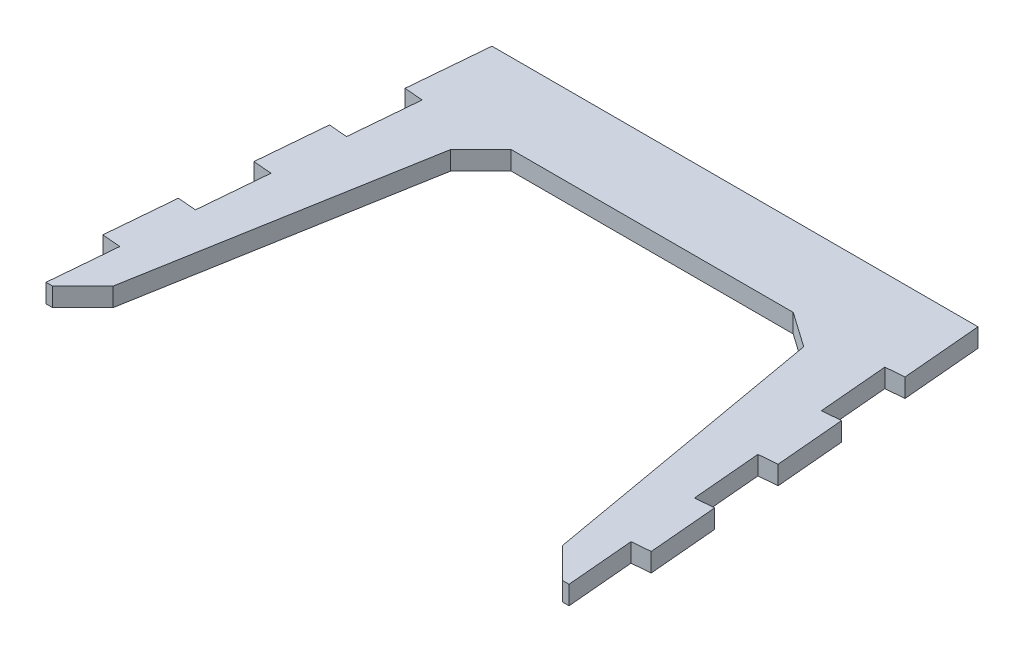
ISO-10303-21;
HEADER;
FILE_DESCRIPTION(('STEP AP214'),'2;1');
FILE_NAME('part.step','',(''),(''),'','','');
FILE_SCHEMA(('AUTOMOTIVE_DESIGN { 1 0 10303 214 1 1 1 1 }'));
ENDSEC;
DATA;
#1=APPLICATION_CONTEXT('core data for automotive mechanical design processes');
#2=APPLICATION_PROTOCOL_DEFINITION('international standard','automotive_design',2000,#1);
#3=PRODUCT_CONTEXT('',#1,'mechanical');
#4=PRODUCT('Part','Part','',(#3));
#5=PRODUCT_RELATED_PRODUCT_CATEGORY('part','',(#4));
#6=PRODUCT_DEFINITION_FORMATION('','',#4);
#7=PRODUCT_DEFINITION_CONTEXT('part definition',#1,'design');
#8=PRODUCT_DEFINITION('design','',#6,#7);
#9=PRODUCT_DEFINITION_SHAPE('','',#8);
#10=(LENGTH_UNIT() NAMED_UNIT(*) SI_UNIT(.MILLI.,.METRE.));
#11=(NAMED_UNIT(*) PLANE_ANGLE_UNIT() SI_UNIT($,.RADIAN.));
#12=(NAMED_UNIT(*) SI_UNIT($,.STERADIAN.) SOLID_ANGLE_UNIT());
#13=UNCERTAINTY_MEASURE_WITH_UNIT(LENGTH_MEASURE(1.E-05),#10,'distance_accuracy_value','');
#14=(GEOMETRIC_REPRESENTATION_CONTEXT(3) GLOBAL_UNCERTAINTY_ASSIGNED_CONTEXT((#13)) GLOBAL_UNIT_ASSIGNED_CONTEXT((#10,
#11,#12)) REPRESENTATION_CONTEXT('',''));
#15=CARTESIAN_POINT('',(0.,0.,0.));
#16=DIRECTION('',(0.,0.,1.));
#17=DIRECTION('',(1.,0.,0.));
#18=AXIS2_PLACEMENT_3D('',#15,#16,#17);
#19=CARTESIAN_POINT('',(-195.0905685814,-15.,-343.177241045668));
#20=DIRECTION('',(-0.99622365842126,0.,-0.0868240888334583));
#21=DIRECTION('',(-0.0868240888334583,0.,0.99622365842126));
#22=AXIS2_PLACEMENT_3D('',#19,#20,#21);
#23=PLANE('',#22);
#24=DIRECTION('',(-0.0868240888334583,0.,0.99622365842126));
#25=VECTOR('',#24,1.);
#26=CARTESIAN_POINT('',(-195.0905685814,-15.,-343.177241045668));
#27=LINE('',#26,#25);
#28=CARTESIAN_POINT('',(-205.544758775303,-15.,-223.225373531356));
#29=VERTEX_POINT('',#28);
#30=CARTESIAN_POINT('',(-210.408460690414,-15.,-167.419030148517));
#31=VERTEX_POINT('',#30);
#32=EDGE_CURVE('E266',#29,#31,#27,.T.);
#33=ORIENTED_EDGE('',*,*,#32,.T.);
#34=DIRECTION('',(0.,1.,0.));
#35=VECTOR('',#34,1.);
#36=CARTESIAN_POINT('',(-210.408460690414,-15.,-167.419030148517));
#37=LINE('',#36,#35);
#38=CARTESIAN_POINT('',(-210.408460690414,0.,-167.419030148517));
#39=VERTEX_POINT('',#38);
#40=EDGE_CURVE('E396',#31,#39,#37,.T.);
#41=ORIENTED_EDGE('',*,*,#40,.T.);
#42=DIRECTION('',(-0.0868240888334583,0.,0.99622365842126));
#43=VECTOR('',#42,1.);
#44=CARTESIAN_POINT('',(-195.0905685814,0.,-343.177241045668));
#45=LINE('',#44,#43);
#46=CARTESIAN_POINT('',(-205.544758775303,0.,-223.225373531356));
#47=VERTEX_POINT('',#46);
#48=EDGE_CURVE('E349',#47,#39,#45,.T.);
#49=ORIENTED_EDGE('',*,*,#48,.F.);
#50=DIRECTION('',(0.,1.,0.));
#51=VECTOR('',#50,1.);
#52=CARTESIAN_POINT('',(-205.544758775303,-15.,-223.225373531356));
#53=LINE('',#52,#51);
#54=EDGE_CURVE('E56',#29,#47,#53,.T.);
#55=ORIENTED_EDGE('',*,*,#54,.F.);
#56=EDGE_LOOP('',(#33,#41,#49,#55));
#57=FACE_BOUND('',#56,.T.);
#58=ADVANCED_FACE('F33',(#57),#23,.T.);
#59=CARTESIAN_POINT('',(-215.272162605525,0.,-111.612686765678));
#60=VERTEX_POINT('',#59);
#61=CARTESIAN_POINT('',(-220.135864520635,0.,-55.806343382839));
#62=VERTEX_POINT('',#61);
#63=EDGE_CURVE('E258',#60,#62,#45,.T.);
#64=ORIENTED_EDGE('',*,*,#63,.F.);
#65=DIRECTION('',(0.,1.,0.));
#66=VECTOR('',#65,1.);
#67=CARTESIAN_POINT('',(-215.272162605525,-15.,-111.612686765678));
#68=LINE('',#67,#66);
#69=CARTESIAN_POINT('',(-215.272162605525,-15.,-111.612686765678));
#70=VERTEX_POINT('',#69);
#71=EDGE_CURVE('E48',#70,#60,#68,.T.);
#72=ORIENTED_EDGE('',*,*,#71,.F.);
#73=CARTESIAN_POINT('',(-220.135864520635,-15.,-55.806343382839));
#74=VERTEX_POINT('',#73);
#75=EDGE_CURVE('E256',#70,#74,#27,.T.);
#76=ORIENTED_EDGE('',*,*,#75,.T.);
#77=DIRECTION('',(0.,1.,0.));
#78=VECTOR('',#77,1.);
#79=CARTESIAN_POINT('',(-220.135864520635,-15.,-55.806343382839));
#80=LINE('',#79,#78);
#81=EDGE_CURVE('E416',#74,#62,#80,.T.);
#82=ORIENTED_EDGE('',*,*,#81,.T.);
#83=EDGE_LOOP('',(#64,#72,#76,#82));
#84=FACE_BOUND('',#83,.T.);
#85=ADVANCED_FACE('F254',(#84),#23,.T.);
#86=CARTESIAN_POINT('',(0.,-15.,0.));
#87=DIRECTION('',(0.,1.,0.));
#88=DIRECTION('',(0.,0.,1.));
#89=AXIS2_PLACEMENT_3D('',#86,#87,#88);
#90=PLANE('',#89);
#91=DIRECTION('',(0.99622365842126,0.,0.0868240888334588));
#92=VECTOR('',#91,1.);
#93=CARTESIAN_POINT('',(-210.408460690414,-15.,-167.419030148517));
#94=LINE('',#93,#92);
#95=CARTESIAN_POINT('',(-195.464671396523,-15.,-166.11663095513));
#96=VERTEX_POINT('',#95);
#97=EDGE_CURVE('E259',#31,#96,#94,.T.);
#98=ORIENTED_EDGE('',*,*,#97,.F.);
#99=ORIENTED_EDGE('',*,*,#32,.F.);
#100=DIRECTION('',(-0.99622365842126,0.,-0.0868240888334586));
#101=VECTOR('',#100,1.);
#102=CARTESIAN_POINT('',(-190.600969481413,-15.,-221.922974337969));
#103=LINE('',#102,#101);
#104=CARTESIAN_POINT('',(-190.600969481413,-15.,-221.922974337969));
#105=VERTEX_POINT('',#104);
#106=EDGE_CURVE('E389',#105,#29,#103,.T.);
#107=ORIENTED_EDGE('',*,*,#106,.F.);
#108=DIRECTION('',(-0.0868240888334584,0.,0.99622365842126));
#109=VECTOR('',#108,1.);
#110=CARTESIAN_POINT('',(-185.737267566302,-15.,-277.729317720808));
#111=LINE('',#110,#109);
#112=CARTESIAN_POINT('',(-185.737267566302,-15.,-277.729317720808));
#113=VERTEX_POINT('',#112);
#114=EDGE_CURVE('E383',#113,#105,#111,.T.);
#115=ORIENTED_EDGE('',*,*,#114,.F.);
#116=DIRECTION('',(0.99622365842126,0.,0.0868240888334571));
#117=VECTOR('',#116,1.);
#118=CARTESIAN_POINT('',(-200.681056860192,-15.,-279.031716914195));
#119=LINE('',#118,#117);
#120=CARTESIAN_POINT('',(-200.681056860192,-15.,-279.031716914195));
#121=VERTEX_POINT('',#120);
#122=EDGE_CURVE('E381',#121,#113,#119,.T.);
#123=ORIENTED_EDGE('',*,*,#122,.F.);
#124=CARTESIAN_POINT('',(-195.0905685814,-15.,-343.177241045668));
#125=VERTEX_POINT('',#124);
#126=EDGE_CURVE('E269',#125,#121,#27,.T.);
#127=ORIENTED_EDGE('',*,*,#126,.F.);
#128=DIRECTION('',(-1.,0.,0.));
#129=VECTOR('',#128,1.);
#130=CARTESIAN_POINT('',(195.0905685814,-15.,-343.177241045668));
#131=LINE('',#130,#129);
#132=CARTESIAN_POINT('',(195.0905685814,-15.,-343.177241045668));
#133=VERTEX_POINT('',#132);
#134=EDGE_CURVE('E267',#133,#125,#131,.T.);
#135=ORIENTED_EDGE('',*,*,#134,.F.);
#136=DIRECTION('',(-0.0868240888334583,0.,-0.99622365842126));
#137=VECTOR('',#136,1.);
#138=CARTESIAN_POINT('',(224.999566435746,-15.,0.));
#139=LINE('',#138,#137);
#140=CARTESIAN_POINT('',(200.681056860192,-15.,-279.031716914195));
#141=VERTEX_POINT('',#140);
#142=EDGE_CURVE('E362',#141,#133,#139,.T.);
#143=ORIENTED_EDGE('',*,*,#142,.F.);
#144=DIRECTION('',(-0.99622365842126,0.,0.0868240888334571));
#145=VECTOR('',#144,1.);
#146=CARTESIAN_POINT('',(200.681056860192,-15.,-279.031716914195));
#147=LINE('',#146,#145);
#148=CARTESIAN_POINT('',(185.737267566302,-15.,-277.729317720808));
#149=VERTEX_POINT('',#148);
#150=EDGE_CURVE('E447',#141,#149,#147,.T.);
#151=ORIENTED_EDGE('',*,*,#150,.T.);
#152=DIRECTION('',(0.0868240888334584,0.,0.99622365842126));
#153=VECTOR('',#152,1.);
#154=CARTESIAN_POINT('',(185.737267566302,-15.,-277.729317720808));
#155=LINE('',#154,#153);
#156=CARTESIAN_POINT('',(190.600969481413,-15.,-221.922974337969));
#157=VERTEX_POINT('',#156);
#158=EDGE_CURVE('E449',#149,#157,#155,.T.);
#159=ORIENTED_EDGE('',*,*,#158,.T.);
#160=DIRECTION('',(0.99622365842126,0.,-0.0868240888334586));
#161=VECTOR('',#160,1.);
#162=CARTESIAN_POINT('',(190.600969481413,-15.,-221.922974337969));
#163=LINE('',#162,#161);
#164=CARTESIAN_POINT('',(205.544758775303,-15.,-223.225373531356));
#165=VERTEX_POINT('',#164);
#166=EDGE_CURVE('E453',#157,#165,#163,.T.);
#167=ORIENTED_EDGE('',*,*,#166,.T.);
#168=CARTESIAN_POINT('',(210.408460690414,-15.,-167.419030148517));
#169=VERTEX_POINT('',#168);
#170=EDGE_CURVE('E364',#169,#165,#139,.T.);
#171=ORIENTED_EDGE('',*,*,#170,.F.);
#172=DIRECTION('',(-0.99622365842126,0.,0.0868240888334588));
#173=VECTOR('',#172,1.);
#174=CARTESIAN_POINT('',(210.408460690414,-15.,-167.419030148517));
#175=LINE('',#174,#173);
#176=CARTESIAN_POINT('',(195.464671396523,-15.,-166.11663095513));
#177=VERTEX_POINT('',#176);
#178=EDGE_CURVE('E422',#169,#177,#175,.T.);
#179=ORIENTED_EDGE('',*,*,#178,.T.);
#180=DIRECTION('',(0.086824088833458,0.,0.99622365842126));
#181=VECTOR('',#180,1.);
#182=CARTESIAN_POINT('',(195.464671396523,-15.,-166.11663095513));
#183=LINE('',#182,#181);
#184=CARTESIAN_POINT('',(200.328373311634,-15.,-110.310287572291));
#185=VERTEX_POINT('',#184);
#186=EDGE_CURVE('E425',#177,#185,#183,.T.);
#187=ORIENTED_EDGE('',*,*,#186,.T.);
#188=DIRECTION('',(0.99622365842126,0.,-0.0868240888334583));
#189=VECTOR('',#188,1.);
#190=CARTESIAN_POINT('',(200.328373311634,-15.,-110.310287572291));
#191=LINE('',#190,#189);
#192=CARTESIAN_POINT('',(215.272162605525,-15.,-111.612686765678));
#193=VERTEX_POINT('',#192);
#194=EDGE_CURVE('E429',#185,#193,#191,.T.);
#195=ORIENTED_EDGE('',*,*,#194,.T.);
#196=CARTESIAN_POINT('',(220.135864520635,-15.,-55.806343382839));
#197=VERTEX_POINT('',#196);
#198=EDGE_CURVE('E272',#197,#193,#139,.T.);
#199=ORIENTED_EDGE('',*,*,#198,.F.);
#200=DIRECTION('',(-0.99622365842126,0.,0.0868240888334585));
#201=VECTOR('',#200,1.);
#202=CARTESIAN_POINT('',(220.135864520635,-15.,-55.806343382839));
#203=LINE('',#202,#201);
#204=CARTESIAN_POINT('',(205.192075226745,-15.,-54.5039441894517));
#205=VERTEX_POINT('',#204);
#206=EDGE_CURVE('E472',#197,#205,#203,.T.);
#207=ORIENTED_EDGE('',*,*,#206,.T.);
#208=DIRECTION('',(0.0868240888334577,0.,0.99622365842126));
#209=VECTOR('',#208,1.);
#210=CARTESIAN_POINT('',(205.192075226745,-15.,-54.5039441894517));
#211=LINE('',#210,#209);
#212=CARTESIAN_POINT('',(209.942268872596,-15.,0.));
#213=VERTEX_POINT('',#212);
#214=EDGE_CURVE('E475',#205,#213,#211,.T.);
#215=ORIENTED_EDGE('',*,*,#214,.T.);
#216=DIRECTION('',(1.,0.,0.));
#217=VECTOR('',#216,1.);
#218=CARTESIAN_POINT('',(184.65484784243,-15.,0.));
#219=LINE('',#218,#217);
#220=CARTESIAN_POINT('',(204.65484784243,-15.,0.));
#221=VERTEX_POINT('',#220);
#222=EDGE_CURVE('E359',#221,#213,#219,.T.);
#223=ORIENTED_EDGE('',*,*,#222,.F.);
#224=DIRECTION('',(0.707106781186549,0.,0.707106781186546));
#225=VECTOR('',#224,1.);
#226=CARTESIAN_POINT('',(180.383482301595,-15.,-24.2713655408353));
#227=LINE('',#226,#225);
#228=CARTESIAN_POINT('',(180.383482301595,-15.,-24.2713655408353));
#229=VERTEX_POINT('',#228);
#230=EDGE_CURVE('E316',#221,#229,#227,.F.);
#231=ORIENTED_EDGE('',*,*,#230,.T.);
#232=DIRECTION('',(0.173320309855024,0.,0.984865508682154));
#233=VECTOR('',#232,1.);
#234=CARTESIAN_POINT('',(135.549804353131,-15.,-279.031716914195));
#235=LINE('',#234,#233);
#236=CARTESIAN_POINT('',(139.016210550232,-15.,-259.334406740552));
#237=VERTEX_POINT('',#236);
#238=EDGE_CURVE('E356',#237,#229,#235,.T.);
#239=ORIENTED_EDGE('',*,*,#238,.F.);
#240=DIRECTION('',(0.818961046161734,0.,0.573849113330045));
#241=VECTOR('',#240,1.);
#242=CARTESIAN_POINT('',(167.655244051473,-15.,-239.266927269653));
#243=LINE('',#242,#241);
#244=CARTESIAN_POINT('',(110.905459184304,-15.,-279.031716914195));
#245=VERTEX_POINT('',#244);
#246=EDGE_CURVE('E307',#237,#245,#243,.F.);
#247=ORIENTED_EDGE('',*,*,#246,.T.);
#248=DIRECTION('',(1.,0.,0.));
#249=VECTOR('',#248,1.);
#250=CARTESIAN_POINT('',(-135.549804353131,-15.,-279.031716914195));
#251=LINE('',#250,#249);
#252=CARTESIAN_POINT('',(-115.549804353131,-15.,-279.031716914195));
#253=VERTEX_POINT('',#252);
#254=EDGE_CURVE('E337',#253,#245,#251,.T.);
#255=ORIENTED_EDGE('',*,*,#254,.F.);
#256=DIRECTION('',(0.707106781186543,0.,-0.707106781186552));
#257=VECTOR('',#256,1.);
#258=CARTESIAN_POINT('',(-197.290760633664,-15.,-197.290760633661));
#259=LINE('',#258,#257);
#260=CARTESIAN_POINT('',(-139.821169893966,-15.,-254.76035137336));
#261=VERTEX_POINT('',#260);
#262=EDGE_CURVE('E302',#253,#261,#259,.F.);
#263=ORIENTED_EDGE('',*,*,#262,.T.);
#264=DIRECTION('',(0.173320309855026,0.,-0.984865508682154));
#265=VECTOR('',#264,1.);
#266=CARTESIAN_POINT('',(-184.65484784243,-15.,0.));
#267=LINE('',#266,#265);
#268=CARTESIAN_POINT('',(-180.383482301595,-15.,-24.2713655408352));
#269=VERTEX_POINT('',#268);
#270=EDGE_CURVE('E327',#269,#261,#267,.T.);
#271=ORIENTED_EDGE('',*,*,#270,.F.);
#272=DIRECTION('',(0.707106781186548,0.,-0.707106781186547));
#273=VECTOR('',#272,1.);
#274=CARTESIAN_POINT('',(-204.65484784243,-15.,0.));
#275=LINE('',#274,#273);
#276=CARTESIAN_POINT('',(-204.65484784243,-15.,0.));
#277=VERTEX_POINT('',#276);
#278=EDGE_CURVE('E11',#269,#277,#275,.F.);
#279=ORIENTED_EDGE('',*,*,#278,.T.);
#280=DIRECTION('',(1.,0.,0.));
#281=VECTOR('',#280,1.);
#282=CARTESIAN_POINT('',(-224.999566435746,-15.,0.));
#283=LINE('',#282,#281);
#284=CARTESIAN_POINT('',(-209.942268872596,-15.,0.));
#285=VERTEX_POINT('',#284);
#286=EDGE_CURVE('E338',#285,#277,#283,.T.);
#287=ORIENTED_EDGE('',*,*,#286,.F.);
#288=DIRECTION('',(-0.0868240888334577,0.,0.99622365842126));
#289=VECTOR('',#288,1.);
#290=CARTESIAN_POINT('',(-205.192075226745,-15.,-54.5039441894517));
#291=LINE('',#290,#289);
#292=CARTESIAN_POINT('',(-205.192075226745,-15.,-54.5039441894517));
#293=VERTEX_POINT('',#292);
#294=EDGE_CURVE('E408',#293,#285,#291,.T.);
#295=ORIENTED_EDGE('',*,*,#294,.F.);
#296=DIRECTION('',(0.99622365842126,0.,0.0868240888334585));
#297=VECTOR('',#296,1.);
#298=CARTESIAN_POINT('',(-220.135864520635,-15.,-55.806343382839));
#299=LINE('',#298,#297);
#300=EDGE_CURVE('E265',#74,#293,#299,.T.);
#301=ORIENTED_EDGE('',*,*,#300,.F.);
#302=ORIENTED_EDGE('',*,*,#75,.F.);
#303=DIRECTION('',(-0.99622365842126,0.,-0.0868240888334583));
#304=VECTOR('',#303,1.);
#305=CARTESIAN_POINT('',(-200.328373311634,-15.,-110.310287572291));
#306=LINE('',#305,#304);
#307=CARTESIAN_POINT('',(-200.328373311634,-15.,-110.310287572291));
#308=VERTEX_POINT('',#307);
#309=EDGE_CURVE('E243',#308,#70,#306,.T.);
#310=ORIENTED_EDGE('',*,*,#309,.F.);
#311=DIRECTION('',(-0.086824088833458,0.,0.99622365842126));
#312=VECTOR('',#311,1.);
#313=CARTESIAN_POINT('',(-195.464671396523,-15.,-166.11663095513));
#314=LINE('',#313,#312);
#315=EDGE_CURVE('E249',#96,#308,#314,.T.);
#316=ORIENTED_EDGE('',*,*,#315,.F.);
#317=EDGE_LOOP('',(#98,#99,#107,#115,#123,#127,#135,#143,#151,#159,#167,#171,#179,#187,#195,
#199,#207,#215,#223,#231,#239,#247,#255,#263,#271,#279,#287,#295,#301,#302,#310,#316));
#318=FACE_BOUND('',#317,.T.);
#319=ADVANCED_FACE('F263',(#318),#90,.F.);
#320=CARTESIAN_POINT('',(0.,0.,0.));
#321=DIRECTION('',(0.,1.,0.));
#322=DIRECTION('',(0.,0.,1.));
#323=AXIS2_PLACEMENT_3D('',#320,#321,#322);
#324=PLANE('',#323);
#325=ORIENTED_EDGE('',*,*,#48,.T.);
#326=DIRECTION('',(0.99622365842126,0.,0.0868240888334588));
#327=VECTOR('',#326,1.);
#328=CARTESIAN_POINT('',(-210.408460690414,0.,-167.419030148517));
#329=LINE('',#328,#327);
#330=CARTESIAN_POINT('',(-195.464671396523,0.,-166.11663095513));
#331=VERTEX_POINT('',#330);
#332=EDGE_CURVE('E250',#39,#331,#329,.T.);
#333=ORIENTED_EDGE('',*,*,#332,.T.);
#334=DIRECTION('',(-0.086824088833458,0.,0.99622365842126));
#335=VECTOR('',#334,1.);
#336=CARTESIAN_POINT('',(-195.464671396523,0.,-166.11663095513));
#337=LINE('',#336,#335);
#338=CARTESIAN_POINT('',(-200.328373311634,0.,-110.310287572291));
#339=VERTEX_POINT('',#338);
#340=EDGE_CURVE('E773',#331,#339,#337,.T.);
#341=ORIENTED_EDGE('',*,*,#340,.T.);
#342=DIRECTION('',(-0.99622365842126,0.,-0.0868240888334583));
#343=VECTOR('',#342,1.);
#344=CARTESIAN_POINT('',(-200.328373311634,0.,-110.310287572291));
#345=LINE('',#344,#343);
#346=EDGE_CURVE('E776',#339,#60,#345,.T.);
#347=ORIENTED_EDGE('',*,*,#346,.T.);
#348=ORIENTED_EDGE('',*,*,#63,.T.);
#349=DIRECTION('',(0.99622365842126,0.,0.0868240888334585));
#350=VECTOR('',#349,1.);
#351=CARTESIAN_POINT('',(-220.135864520635,0.,-55.806343382839));
#352=LINE('',#351,#350);
#353=CARTESIAN_POINT('',(-205.192075226745,0.,-54.5039441894517));
#354=VERTEX_POINT('',#353);
#355=EDGE_CURVE('E410',#62,#354,#352,.T.);
#356=ORIENTED_EDGE('',*,*,#355,.T.);
#357=DIRECTION('',(-0.0868240888334577,0.,0.99622365842126));
#358=VECTOR('',#357,1.);
#359=CARTESIAN_POINT('',(-205.192075226745,0.,-54.5039441894517));
#360=LINE('',#359,#358);
#361=CARTESIAN_POINT('',(-209.942268872596,0.,0.));
#362=VERTEX_POINT('',#361);
#363=EDGE_CURVE('E404',#354,#362,#360,.T.);
#364=ORIENTED_EDGE('',*,*,#363,.T.);
#365=DIRECTION('',(1.,0.,0.));
#366=VECTOR('',#365,1.);
#367=CARTESIAN_POINT('',(-224.999566435746,0.,0.));
#368=LINE('',#367,#366);
#369=CARTESIAN_POINT('',(-204.65484784243,0.,0.));
#370=VERTEX_POINT('',#369);
#371=EDGE_CURVE('E344',#362,#370,#368,.T.);
#372=ORIENTED_EDGE('',*,*,#371,.T.);
#373=DIRECTION('',(-0.707106781186548,0.,0.707106781186547));
#374=VECTOR('',#373,1.);
#375=CARTESIAN_POINT('',(-102.327423921215,0.,-102.327423921215));
#376=LINE('',#375,#374);
#377=CARTESIAN_POINT('',(-180.383482301595,0.,-24.2713655408352));
#378=VERTEX_POINT('',#377);
#379=EDGE_CURVE('E321',#370,#378,#376,.F.);
#380=ORIENTED_EDGE('',*,*,#379,.T.);
#381=DIRECTION('',(0.173320309855026,0.,-0.984865508682154));
#382=VECTOR('',#381,1.);
#383=CARTESIAN_POINT('',(-184.65484784243,0.,0.));
#384=LINE('',#383,#382);
#385=CARTESIAN_POINT('',(-139.821169893966,0.,-254.76035137336));
#386=VERTEX_POINT('',#385);
#387=EDGE_CURVE('E328',#378,#386,#384,.T.);
#388=ORIENTED_EDGE('',*,*,#387,.T.);
#389=DIRECTION('',(-0.707106781186543,0.,0.707106781186552));
#390=VECTOR('',#389,1.);
#391=CARTESIAN_POINT('',(-139.821169893966,0.,-254.76035137336));
#392=LINE('',#391,#390);
#393=CARTESIAN_POINT('',(-115.549804353131,0.,-279.031716914195));
#394=VERTEX_POINT('',#393);
#395=EDGE_CURVE('E300',#386,#394,#392,.F.);
#396=ORIENTED_EDGE('',*,*,#395,.T.);
#397=DIRECTION('',(1.,0.,0.));
#398=VECTOR('',#397,1.);
#399=CARTESIAN_POINT('',(-135.549804353131,0.,-279.031716914195));
#400=LINE('',#399,#398);
#401=CARTESIAN_POINT('',(110.905459184304,0.,-279.031716914195));
#402=VERTEX_POINT('',#401);
#403=EDGE_CURVE('E510',#394,#402,#400,.T.);
#404=ORIENTED_EDGE('',*,*,#403,.T.);
#405=DIRECTION('',(-0.818961046161734,0.,-0.573849113330045));
#406=VECTOR('',#405,1.);
#407=CARTESIAN_POINT('',(110.905459184304,0.,-279.031716914195));
#408=LINE('',#407,#406);
#409=CARTESIAN_POINT('',(139.016210550232,0.,-259.334406740552));
#410=VERTEX_POINT('',#409);
#411=EDGE_CURVE('E305',#402,#410,#408,.F.);
#412=ORIENTED_EDGE('',*,*,#411,.T.);
#413=DIRECTION('',(0.173320309855024,0.,0.984865508682154));
#414=VECTOR('',#413,1.);
#415=CARTESIAN_POINT('',(135.549804353131,0.,-279.031716914195));
#416=LINE('',#415,#414);
#417=CARTESIAN_POINT('',(180.383482301595,0.,-24.2713655408352));
#418=VERTEX_POINT('',#417);
#419=EDGE_CURVE('E507',#410,#418,#416,.T.);
#420=ORIENTED_EDGE('',*,*,#419,.T.);
#421=DIRECTION('',(-0.707106781186549,0.,-0.707106781186546));
#422=VECTOR('',#421,1.);
#423=CARTESIAN_POINT('',(102.327423921215,0.,-102.327423921215));
#424=LINE('',#423,#422);
#425=CARTESIAN_POINT('',(204.65484784243,0.,0.));
#426=VERTEX_POINT('',#425);
#427=EDGE_CURVE('E312',#418,#426,#424,.F.);
#428=ORIENTED_EDGE('',*,*,#427,.T.);
#429=DIRECTION('',(1.,0.,0.));
#430=VECTOR('',#429,1.);
#431=CARTESIAN_POINT('',(184.65484784243,0.,0.));
#432=LINE('',#431,#430);
#433=CARTESIAN_POINT('',(209.942268872596,0.,0.));
#434=VERTEX_POINT('',#433);
#435=EDGE_CURVE('E505',#426,#434,#432,.T.);
#436=ORIENTED_EDGE('',*,*,#435,.T.);
#437=DIRECTION('',(0.0868240888334577,0.,0.99622365842126));
#438=VECTOR('',#437,1.);
#439=CARTESIAN_POINT('',(205.192075226745,0.,-54.5039441894517));
#440=LINE('',#439,#438);
#441=CARTESIAN_POINT('',(205.192075226745,0.,-54.5039441894517));
#442=VERTEX_POINT('',#441);
#443=EDGE_CURVE('E476',#442,#434,#440,.T.);
#444=ORIENTED_EDGE('',*,*,#443,.F.);
#445=DIRECTION('',(-0.99622365842126,0.,0.0868240888334585));
#446=VECTOR('',#445,1.);
#447=CARTESIAN_POINT('',(220.135864520635,0.,-55.806343382839));
#448=LINE('',#447,#446);
#449=CARTESIAN_POINT('',(220.135864520635,0.,-55.806343382839));
#450=VERTEX_POINT('',#449);
#451=EDGE_CURVE('E466',#450,#442,#448,.T.);
#452=ORIENTED_EDGE('',*,*,#451,.F.);
#453=DIRECTION('',(-0.0868240888334583,0.,-0.99622365842126));
#454=VECTOR('',#453,1.);
#455=CARTESIAN_POINT('',(224.999566435746,0.,0.));
#456=LINE('',#455,#454);
#457=CARTESIAN_POINT('',(215.272162605525,0.,-111.612686765678));
#458=VERTEX_POINT('',#457);
#459=EDGE_CURVE('E497',#450,#458,#456,.T.);
#460=ORIENTED_EDGE('',*,*,#459,.T.);
#461=DIRECTION('',(0.99622365842126,0.,-0.0868240888334583));
#462=VECTOR('',#461,1.);
#463=CARTESIAN_POINT('',(200.328373311634,0.,-110.310287572291));
#464=LINE('',#463,#462);
#465=CARTESIAN_POINT('',(200.328373311634,0.,-110.310287572291));
#466=VERTEX_POINT('',#465);
#467=EDGE_CURVE('E426',#466,#458,#464,.T.);
#468=ORIENTED_EDGE('',*,*,#467,.F.);
#469=DIRECTION('',(0.086824088833458,0.,0.99622365842126));
#470=VECTOR('',#469,1.);
#471=CARTESIAN_POINT('',(195.464671396523,0.,-166.11663095513));
#472=LINE('',#471,#470);
#473=CARTESIAN_POINT('',(195.464671396523,0.,-166.11663095513));
#474=VERTEX_POINT('',#473);
#475=EDGE_CURVE('E435',#474,#466,#472,.T.);
#476=ORIENTED_EDGE('',*,*,#475,.F.);
#477=DIRECTION('',(-0.99622365842126,0.,0.0868240888334588));
#478=VECTOR('',#477,1.);
#479=CARTESIAN_POINT('',(210.408460690414,0.,-167.419030148517));
#480=LINE('',#479,#478);
#481=CARTESIAN_POINT('',(210.408460690414,0.,-167.419030148517));
#482=VERTEX_POINT('',#481);
#483=EDGE_CURVE('E418',#482,#474,#480,.T.);
#484=ORIENTED_EDGE('',*,*,#483,.F.);
#485=CARTESIAN_POINT('',(205.544758775303,0.,-223.225373531356));
#486=VERTEX_POINT('',#485);
#487=EDGE_CURVE('E500',#482,#486,#456,.T.);
#488=ORIENTED_EDGE('',*,*,#487,.T.);
#489=DIRECTION('',(0.99622365842126,0.,-0.0868240888334586));
#490=VECTOR('',#489,1.);
#491=CARTESIAN_POINT('',(190.600969481413,0.,-221.922974337969));
#492=LINE('',#491,#490);
#493=CARTESIAN_POINT('',(190.600969481413,0.,-221.922974337969));
#494=VERTEX_POINT('',#493);
#495=EDGE_CURVE('E450',#494,#486,#492,.T.);
#496=ORIENTED_EDGE('',*,*,#495,.F.);
#497=DIRECTION('',(0.0868240888334584,0.,0.99622365842126));
#498=VECTOR('',#497,1.);
#499=CARTESIAN_POINT('',(185.737267566302,0.,-277.729317720808));
#500=LINE('',#499,#498);
#501=CARTESIAN_POINT('',(185.737267566302,0.,-277.729317720808));
#502=VERTEX_POINT('',#501);
#503=EDGE_CURVE('E458',#502,#494,#500,.T.);
#504=ORIENTED_EDGE('',*,*,#503,.F.);
#505=DIRECTION('',(-0.99622365842126,0.,0.0868240888334571));
#506=VECTOR('',#505,1.);
#507=CARTESIAN_POINT('',(200.681056860192,0.,-279.031716914195));
#508=LINE('',#507,#506);
#509=CARTESIAN_POINT('',(200.681056860192,0.,-279.031716914195));
#510=VERTEX_POINT('',#509);
#511=EDGE_CURVE('E441',#510,#502,#508,.T.);
#512=ORIENTED_EDGE('',*,*,#511,.F.);
#513=CARTESIAN_POINT('',(195.0905685814,0.,-343.177241045668));
#514=VERTEX_POINT('',#513);
#515=EDGE_CURVE('E502',#510,#514,#456,.T.);
#516=ORIENTED_EDGE('',*,*,#515,.T.);
#517=DIRECTION('',(-1.,0.,0.));
#518=VECTOR('',#517,1.);
#519=CARTESIAN_POINT('',(195.0905685814,0.,-343.177241045668));
#520=LINE('',#519,#518);
#521=CARTESIAN_POINT('',(-195.0905685814,0.,-343.177241045668));
#522=VERTEX_POINT('',#521);
#523=EDGE_CURVE('E378',#514,#522,#520,.T.);
#524=ORIENTED_EDGE('',*,*,#523,.T.);
#525=CARTESIAN_POINT('',(-200.681056860192,0.,-279.031716914195));
#526=VERTEX_POINT('',#525);
#527=EDGE_CURVE('E346',#522,#526,#45,.T.);
#528=ORIENTED_EDGE('',*,*,#527,.T.);
#529=DIRECTION('',(0.99622365842126,0.,0.0868240888334571));
#530=VECTOR('',#529,1.);
#531=CARTESIAN_POINT('',(-200.681056860192,0.,-279.031716914195));
#532=LINE('',#531,#530);
#533=CARTESIAN_POINT('',(-185.737267566302,0.,-277.729317720808));
#534=VERTEX_POINT('',#533);
#535=EDGE_CURVE('E399',#526,#534,#532,.T.);
#536=ORIENTED_EDGE('',*,*,#535,.T.);
#537=DIRECTION('',(-0.0868240888334584,0.,0.99622365842126));
#538=VECTOR('',#537,1.);
#539=CARTESIAN_POINT('',(-185.737267566302,0.,-277.729317720808));
#540=LINE('',#539,#538);
#541=CARTESIAN_POINT('',(-190.600969481413,0.,-221.922974337969));
#542=VERTEX_POINT('',#541);
#543=EDGE_CURVE('E395',#534,#542,#540,.T.);
#544=ORIENTED_EDGE('',*,*,#543,.T.);
#545=DIRECTION('',(-0.99622365842126,0.,-0.0868240888334586));
#546=VECTOR('',#545,1.);
#547=CARTESIAN_POINT('',(-190.600969481413,0.,-221.922974337969));
#548=LINE('',#547,#546);
#549=EDGE_CURVE('E393',#542,#47,#548,.T.);
#550=ORIENTED_EDGE('',*,*,#549,.T.);
#551=EDGE_LOOP('',(#325,#333,#341,#347,#348,#356,#364,#372,#380,#388,#396,#404,#412,#420,#428,
#436,#444,#452,#460,#468,#476,#484,#488,#496,#504,#512,#516,#524,#528,#536,#544,#550));
#552=FACE_BOUND('',#551,.T.);
#553=ADVANCED_FACE('F495',(#552),#324,.T.);
#554=ORIENTED_EDGE('',*,*,#126,.T.);
#555=DIRECTION('',(0.,1.,0.));
#556=VECTOR('',#555,1.);
#557=CARTESIAN_POINT('',(-200.681056860192,-15.,-279.031716914195));
#558=LINE('',#557,#556);
#559=EDGE_CURVE('E402',#121,#526,#558,.T.);
#560=ORIENTED_EDGE('',*,*,#559,.T.);
#561=ORIENTED_EDGE('',*,*,#527,.F.);
#562=DIRECTION('',(0.,1.,0.));
#563=VECTOR('',#562,1.);
#564=CARTESIAN_POINT('',(-195.0905685814,-15.,-343.177241045668));
#565=LINE('',#564,#563);
#566=EDGE_CURVE('E281',#125,#522,#565,.T.);
#567=ORIENTED_EDGE('',*,*,#566,.F.);
#568=EDGE_LOOP('',(#554,#560,#561,#567));
#569=FACE_BOUND('',#568,.T.);
#570=ADVANCED_FACE('F538',(#569),#23,.T.);
#571=CARTESIAN_POINT('',(-224.999566435746,-15.,0.));
#572=DIRECTION('',(0.,0.,1.));
#573=DIRECTION('',(1.,0.,0.));
#574=AXIS2_PLACEMENT_3D('',#571,#572,#573);
#575=PLANE('',#574);
#576=ORIENTED_EDGE('',*,*,#371,.F.);
#577=DIRECTION('',(0.,1.,0.));
#578=VECTOR('',#577,1.);
#579=CARTESIAN_POINT('',(-209.942268872596,-15.,0.));
#580=LINE('',#579,#578);
#581=EDGE_CURVE('E345',#285,#362,#580,.T.);
#582=ORIENTED_EDGE('',*,*,#581,.F.);
#583=ORIENTED_EDGE('',*,*,#286,.T.);
#584=DIRECTION('',(0.,1.,0.));
#585=VECTOR('',#584,1.);
#586=CARTESIAN_POINT('',(-204.65484784243,-15.,0.));
#587=LINE('',#586,#585);
#588=EDGE_CURVE('E318',#277,#370,#587,.T.);
#589=ORIENTED_EDGE('',*,*,#588,.T.);
#590=EDGE_LOOP('',(#576,#582,#583,#589));
#591=FACE_BOUND('',#590,.T.);
#592=ADVANCED_FACE('F342',(#591),#575,.T.);
#593=CARTESIAN_POINT('',(224.999566435746,-15.,0.));
#594=DIRECTION('',(0.99622365842126,0.,-0.0868240888334583));
#595=DIRECTION('',(-0.0868240888334583,0.,-0.99622365842126));
#596=AXIS2_PLACEMENT_3D('',#593,#594,#595);
#597=PLANE('',#596);
#598=DIRECTION('',(0.,1.,0.));
#599=VECTOR('',#598,1.);
#600=CARTESIAN_POINT('',(215.272162605525,-15.,-111.612686765678));
#601=LINE('',#600,#599);
#602=EDGE_CURVE('E439',#193,#458,#601,.T.);
#603=ORIENTED_EDGE('',*,*,#602,.T.);
#604=ORIENTED_EDGE('',*,*,#459,.F.);
#605=DIRECTION('',(0.,1.,0.));
#606=VECTOR('',#605,1.);
#607=CARTESIAN_POINT('',(220.135864520635,-15.,-55.806343382839));
#608=LINE('',#607,#606);
#609=EDGE_CURVE('E351',#197,#450,#608,.T.);
#610=ORIENTED_EDGE('',*,*,#609,.F.);
#611=ORIENTED_EDGE('',*,*,#198,.T.);
#612=EDGE_LOOP('',(#603,#604,#610,#611));
#613=FACE_BOUND('',#612,.T.);
#614=ADVANCED_FACE('F499',(#613),#597,.T.);
#615=DIRECTION('',(0.,1.,0.));
#616=VECTOR('',#615,1.);
#617=CARTESIAN_POINT('',(210.408460690414,-15.,-167.419030148517));
#618=LINE('',#617,#616);
#619=EDGE_CURVE('E432',#169,#482,#618,.T.);
#620=ORIENTED_EDGE('',*,*,#619,.F.);
#621=ORIENTED_EDGE('',*,*,#170,.T.);
#622=DIRECTION('',(0.,1.,0.));
#623=VECTOR('',#622,1.);
#624=CARTESIAN_POINT('',(205.544758775303,-15.,-223.225373531356));
#625=LINE('',#624,#623);
#626=EDGE_CURVE('E463',#165,#486,#625,.T.);
#627=ORIENTED_EDGE('',*,*,#626,.T.);
#628=ORIENTED_EDGE('',*,*,#487,.F.);
#629=EDGE_LOOP('',(#620,#621,#627,#628));
#630=FACE_BOUND('',#629,.T.);
#631=ADVANCED_FACE('F588',(#630),#597,.T.);
#632=CARTESIAN_POINT('',(195.0905685814,-15.,-343.177241045668));
#633=DIRECTION('',(0.,0.,-1.));
#634=DIRECTION('',(-1.,0.,0.));
#635=AXIS2_PLACEMENT_3D('',#632,#633,#634);
#636=PLANE('',#635);
#637=ORIENTED_EDGE('',*,*,#523,.F.);
#638=DIRECTION('',(0.,1.,0.));
#639=VECTOR('',#638,1.);
#640=CARTESIAN_POINT('',(195.0905685814,-15.,-343.177241045668));
#641=LINE('',#640,#639);
#642=EDGE_CURVE('E276',#133,#514,#641,.T.);
#643=ORIENTED_EDGE('',*,*,#642,.F.);
#644=ORIENTED_EDGE('',*,*,#134,.T.);
#645=ORIENTED_EDGE('',*,*,#566,.T.);
#646=EDGE_LOOP('',(#637,#643,#644,#645));
#647=FACE_BOUND('',#646,.T.);
#648=ADVANCED_FACE('F376',(#647),#636,.T.);
#649=DIRECTION('',(0.,1.,0.));
#650=VECTOR('',#649,1.);
#651=CARTESIAN_POINT('',(200.681056860192,-15.,-279.031716914195));
#652=LINE('',#651,#650);
#653=EDGE_CURVE('E372',#141,#510,#652,.T.);
#654=ORIENTED_EDGE('',*,*,#653,.F.);
#655=ORIENTED_EDGE('',*,*,#142,.T.);
#656=ORIENTED_EDGE('',*,*,#642,.T.);
#657=ORIENTED_EDGE('',*,*,#515,.F.);
#658=EDGE_LOOP('',(#654,#655,#656,#657));
#659=FACE_BOUND('',#658,.T.);
#660=ADVANCED_FACE('F371',(#659),#597,.T.);
#661=CARTESIAN_POINT('',(184.65484784243,-15.,0.));
#662=DIRECTION('',(0.,0.,1.));
#663=DIRECTION('',(1.,0.,0.));
#664=AXIS2_PLACEMENT_3D('',#661,#662,#663);
#665=PLANE('',#664);
#666=DIRECTION('',(0.,1.,0.));
#667=VECTOR('',#666,1.);
#668=CARTESIAN_POINT('',(209.942268872596,-15.,0.));
#669=LINE('',#668,#667);
#670=EDGE_CURVE('E482',#213,#434,#669,.T.);
#671=ORIENTED_EDGE('',*,*,#670,.T.);
#672=ORIENTED_EDGE('',*,*,#435,.F.);
#673=DIRECTION('',(0.,-1.,0.));
#674=VECTOR('',#673,1.);
#675=CARTESIAN_POINT('',(204.65484784243,-15.,0.));
#676=LINE('',#675,#674);
#677=EDGE_CURVE('E314',#426,#221,#676,.T.);
#678=ORIENTED_EDGE('',*,*,#677,.T.);
#679=ORIENTED_EDGE('',*,*,#222,.T.);
#680=EDGE_LOOP('',(#671,#672,#678,#679));
#681=FACE_BOUND('',#680,.T.);
#682=ADVANCED_FACE('F597',(#681),#665,.T.);
#683=CARTESIAN_POINT('',(135.549804353131,-15.,-279.031716914195));
#684=DIRECTION('',(-0.984865508682154,0.,0.173320309855024));
#685=DIRECTION('',(0.173320309855024,0.,0.984865508682154));
#686=AXIS2_PLACEMENT_3D('',#683,#684,#685);
#687=PLANE('',#686);
#688=ORIENTED_EDGE('',*,*,#238,.T.);
#689=DIRECTION('',(0.,1.,0.));
#690=VECTOR('',#689,1.);
#691=CARTESIAN_POINT('',(180.383482301595,-15.,-24.2713655408352));
#692=LINE('',#691,#690);
#693=EDGE_CURVE('E309',#229,#418,#692,.T.);
#694=ORIENTED_EDGE('',*,*,#693,.T.);
#695=ORIENTED_EDGE('',*,*,#419,.F.);
#696=DIRECTION('',(0.,-1.,0.));
#697=VECTOR('',#696,1.);
#698=CARTESIAN_POINT('',(139.016210550232,-15.,-259.334406740552));
#699=LINE('',#698,#697);
#700=EDGE_CURVE('E298',#410,#237,#699,.T.);
#701=ORIENTED_EDGE('',*,*,#700,.T.);
#702=EDGE_LOOP('',(#688,#694,#695,#701));
#703=FACE_BOUND('',#702,.T.);
#704=ADVANCED_FACE('F605',(#703),#687,.T.);
#705=CARTESIAN_POINT('',(-135.549804353131,-15.,-279.031716914195));
#706=DIRECTION('',(0.,0.,1.));
#707=DIRECTION('',(1.,0.,0.));
#708=AXIS2_PLACEMENT_3D('',#705,#706,#707);
#709=PLANE('',#708);
#710=ORIENTED_EDGE('',*,*,#403,.F.);
#711=DIRECTION('',(0.,-1.,0.));
#712=VECTOR('',#711,1.);
#713=CARTESIAN_POINT('',(-115.549804353131,-15.,-279.031716914195));
#714=LINE('',#713,#712);
#715=EDGE_CURVE('E296',#394,#253,#714,.T.);
#716=ORIENTED_EDGE('',*,*,#715,.T.);
#717=ORIENTED_EDGE('',*,*,#254,.T.);
#718=DIRECTION('',(0.,1.,0.));
#719=VECTOR('',#718,1.);
#720=CARTESIAN_POINT('',(110.905459184304,0.,-279.031716914195));
#721=LINE('',#720,#719);
#722=EDGE_CURVE('E293',#245,#402,#721,.T.);
#723=ORIENTED_EDGE('',*,*,#722,.T.);
#724=EDGE_LOOP('',(#710,#716,#717,#723));
#725=FACE_BOUND('',#724,.T.);
#726=ADVANCED_FACE('F613',(#725),#709,.T.);
#727=CARTESIAN_POINT('',(-184.65484784243,-15.,0.));
#728=DIRECTION('',(0.984865508682154,0.,0.173320309855026));
#729=DIRECTION('',(0.173320309855026,0.,-0.984865508682154));
#730=AXIS2_PLACEMENT_3D('',#727,#728,#729);
#731=PLANE('',#730);
#732=ORIENTED_EDGE('',*,*,#387,.F.);
#733=DIRECTION('',(0.,-1.,0.));
#734=VECTOR('',#733,1.);
#735=CARTESIAN_POINT('',(-180.383482301595,-15.,-24.2713655408352));
#736=LINE('',#735,#734);
#737=EDGE_CURVE('E41',#378,#269,#736,.T.);
#738=ORIENTED_EDGE('',*,*,#737,.T.);
#739=ORIENTED_EDGE('',*,*,#270,.T.);
#740=DIRECTION('',(0.,1.,0.));
#741=VECTOR('',#740,1.);
#742=CARTESIAN_POINT('',(-139.821169893966,0.,-254.76035137336));
#743=LINE('',#742,#741);
#744=EDGE_CURVE('E287',#261,#386,#743,.T.);
#745=ORIENTED_EDGE('',*,*,#744,.T.);
#746=EDGE_LOOP('',(#732,#738,#739,#745));
#747=FACE_BOUND('',#746,.T.);
#748=ADVANCED_FACE('F326',(#747),#731,.T.);
#749=CARTESIAN_POINT('',(-139.821169893966,-15.,-254.76035137336));
#750=DIRECTION('',(0.707106781186552,0.,0.707106781186543));
#751=DIRECTION('',(0.,-1.,0.));
#752=AXIS2_PLACEMENT_3D('',#749,#750,#751);
#753=PLANE('',#752);
#754=ORIENTED_EDGE('',*,*,#262,.F.);
#755=ORIENTED_EDGE('',*,*,#715,.F.);
#756=ORIENTED_EDGE('',*,*,#395,.F.);
#757=ORIENTED_EDGE('',*,*,#744,.F.);
#758=EDGE_LOOP('',(#754,#755,#756,#757));
#759=FACE_BOUND('',#758,.T.);
#760=ADVANCED_FACE('F617',(#759),#753,.T.);
#761=CARTESIAN_POINT('',(110.905459184304,-15.,-279.031716914195));
#762=DIRECTION('',(-0.573849113330045,0.,0.818961046161734));
#763=DIRECTION('',(0.,-1.,0.));
#764=AXIS2_PLACEMENT_3D('',#761,#762,#763);
#765=PLANE('',#764);
#766=ORIENTED_EDGE('',*,*,#246,.F.);
#767=ORIENTED_EDGE('',*,*,#700,.F.);
#768=ORIENTED_EDGE('',*,*,#411,.F.);
#769=ORIENTED_EDGE('',*,*,#722,.F.);
#770=EDGE_LOOP('',(#766,#767,#768,#769));
#771=FACE_BOUND('',#770,.T.);
#772=ADVANCED_FACE('F609',(#771),#765,.T.);
#773=CARTESIAN_POINT('',(180.383482301595,-15.,-24.2713655408353));
#774=DIRECTION('',(0.707106781186546,0.,-0.707106781186549));
#775=DIRECTION('',(0.,1.,0.));
#776=AXIS2_PLACEMENT_3D('',#773,#774,#775);
#777=PLANE('',#776);
#778=ORIENTED_EDGE('',*,*,#230,.F.);
#779=ORIENTED_EDGE('',*,*,#677,.F.);
#780=ORIENTED_EDGE('',*,*,#427,.F.);
#781=ORIENTED_EDGE('',*,*,#693,.F.);
#782=EDGE_LOOP('',(#778,#779,#780,#781));
#783=FACE_BOUND('',#782,.T.);
#784=ADVANCED_FACE('F600',(#783),#777,.F.);
#785=CARTESIAN_POINT('',(-204.65484784243,-15.,0.));
#786=DIRECTION('',(-0.707106781186547,0.,-0.707106781186548));
#787=DIRECTION('',(0.,1.,0.));
#788=AXIS2_PLACEMENT_3D('',#785,#786,#787);
#789=PLANE('',#788);
#790=ORIENTED_EDGE('',*,*,#278,.F.);
#791=ORIENTED_EDGE('',*,*,#737,.F.);
#792=ORIENTED_EDGE('',*,*,#379,.F.);
#793=ORIENTED_EDGE('',*,*,#588,.F.);
#794=EDGE_LOOP('',(#790,#791,#792,#793));
#795=FACE_BOUND('',#794,.T.);
#796=ADVANCED_FACE('F35',(#795),#789,.F.);
#797=CARTESIAN_POINT('',(205.192075226745,-15.,-54.5039441894517));
#798=DIRECTION('',(-0.99622365842126,0.,0.0868240888334577));
#799=DIRECTION('',(0.0868240888334577,0.,0.99622365842126));
#800=AXIS2_PLACEMENT_3D('',#797,#798,#799);
#801=PLANE('',#800);
#802=ORIENTED_EDGE('',*,*,#443,.T.);
#803=ORIENTED_EDGE('',*,*,#670,.F.);
#804=ORIENTED_EDGE('',*,*,#214,.F.);
#805=DIRECTION('',(0.,1.,0.));
#806=VECTOR('',#805,1.);
#807=CARTESIAN_POINT('',(205.192075226745,-15.,-54.5039441894517));
#808=LINE('',#807,#806);
#809=EDGE_CURVE('E484',#205,#442,#808,.T.);
#810=ORIENTED_EDGE('',*,*,#809,.T.);
#811=EDGE_LOOP('',(#802,#803,#804,#810));
#812=FACE_BOUND('',#811,.T.);
#813=ADVANCED_FACE('F558',(#812),#801,.F.);
#814=CARTESIAN_POINT('',(220.135864520635,-15.,-55.806343382839));
#815=DIRECTION('',(-0.0868240888334585,0.,-0.99622365842126));
#816=DIRECTION('',(-0.99622365842126,0.,0.0868240888334585));
#817=AXIS2_PLACEMENT_3D('',#814,#815,#816);
#818=PLANE('',#817);
#819=ORIENTED_EDGE('',*,*,#451,.T.);
#820=ORIENTED_EDGE('',*,*,#809,.F.);
#821=ORIENTED_EDGE('',*,*,#206,.F.);
#822=ORIENTED_EDGE('',*,*,#609,.T.);
#823=EDGE_LOOP('',(#819,#820,#821,#822));
#824=FACE_BOUND('',#823,.T.);
#825=ADVANCED_FACE('F489',(#824),#818,.F.);
#826=CARTESIAN_POINT('',(190.600969481413,-15.,-221.922974337969));
#827=DIRECTION('',(0.0868240888334587,0.,0.99622365842126));
#828=DIRECTION('',(0.99622365842126,0.,-0.0868240888334587));
#829=AXIS2_PLACEMENT_3D('',#826,#827,#828);
#830=PLANE('',#829);
#831=ORIENTED_EDGE('',*,*,#495,.T.);
#832=ORIENTED_EDGE('',*,*,#626,.F.);
#833=ORIENTED_EDGE('',*,*,#166,.F.);
#834=DIRECTION('',(0.,1.,0.));
#835=VECTOR('',#834,1.);
#836=CARTESIAN_POINT('',(190.600969481413,-15.,-221.922974337969));
#837=LINE('',#836,#835);
#838=EDGE_CURVE('E467',#157,#494,#837,.T.);
#839=ORIENTED_EDGE('',*,*,#838,.T.);
#840=EDGE_LOOP('',(#831,#832,#833,#839));
#841=FACE_BOUND('',#840,.T.);
#842=ADVANCED_FACE('F557',(#841),#830,.F.);
#843=CARTESIAN_POINT('',(185.737267566302,-15.,-277.729317720808));
#844=DIRECTION('',(-0.99622365842126,0.,0.0868240888334585));
#845=DIRECTION('',(0.0868240888334585,0.,0.99622365842126));
#846=AXIS2_PLACEMENT_3D('',#843,#844,#845);
#847=PLANE('',#846);
#848=ORIENTED_EDGE('',*,*,#503,.T.);
#849=ORIENTED_EDGE('',*,*,#838,.F.);
#850=ORIENTED_EDGE('',*,*,#158,.F.);
#851=DIRECTION('',(0.,1.,0.));
#852=VECTOR('',#851,1.);
#853=CARTESIAN_POINT('',(185.737267566302,-15.,-277.729317720808));
#854=LINE('',#853,#852);
#855=EDGE_CURVE('E469',#149,#502,#854,.T.);
#856=ORIENTED_EDGE('',*,*,#855,.T.);
#857=EDGE_LOOP('',(#848,#849,#850,#856));
#858=FACE_BOUND('',#857,.T.);
#859=ADVANCED_FACE('F565',(#858),#847,.F.);
#860=CARTESIAN_POINT('',(200.681056860192,-15.,-279.031716914195));
#861=DIRECTION('',(-0.0868240888334571,0.,-0.99622365842126));
#862=DIRECTION('',(-0.99622365842126,0.,0.0868240888334571));
#863=AXIS2_PLACEMENT_3D('',#860,#861,#862);
#864=PLANE('',#863);
#865=ORIENTED_EDGE('',*,*,#511,.T.);
#866=ORIENTED_EDGE('',*,*,#855,.F.);
#867=ORIENTED_EDGE('',*,*,#150,.F.);
#868=ORIENTED_EDGE('',*,*,#653,.T.);
#869=EDGE_LOOP('',(#865,#866,#867,#868));
#870=FACE_BOUND('',#869,.T.);
#871=ADVANCED_FACE('F561',(#870),#864,.F.);
#872=CARTESIAN_POINT('',(200.328373311634,-15.,-110.310287572291));
#873=DIRECTION('',(0.0868240888334583,0.,0.99622365842126));
#874=DIRECTION('',(0.99622365842126,0.,-0.0868240888334583));
#875=AXIS2_PLACEMENT_3D('',#872,#873,#874);
#876=PLANE('',#875);
#877=ORIENTED_EDGE('',*,*,#467,.T.);
#878=ORIENTED_EDGE('',*,*,#602,.F.);
#879=ORIENTED_EDGE('',*,*,#194,.F.);
#880=DIRECTION('',(0.,1.,0.));
#881=VECTOR('',#880,1.);
#882=CARTESIAN_POINT('',(200.328373311634,-15.,-110.310287572291));
#883=LINE('',#882,#881);
#884=EDGE_CURVE('E442',#185,#466,#883,.T.);
#885=ORIENTED_EDGE('',*,*,#884,.T.);
#886=EDGE_LOOP('',(#877,#878,#879,#885));
#887=FACE_BOUND('',#886,.T.);
#888=ADVANCED_FACE('F564',(#887),#876,.F.);
#889=CARTESIAN_POINT('',(195.464671396523,-15.,-166.11663095513));
#890=DIRECTION('',(-0.99622365842126,0.,0.086824088833458));
#891=DIRECTION('',(0.086824088833458,0.,0.99622365842126));
#892=AXIS2_PLACEMENT_3D('',#889,#890,#891);
#893=PLANE('',#892);
#894=ORIENTED_EDGE('',*,*,#475,.T.);
#895=ORIENTED_EDGE('',*,*,#884,.F.);
#896=ORIENTED_EDGE('',*,*,#186,.F.);
#897=DIRECTION('',(0.,1.,0.));
#898=VECTOR('',#897,1.);
#899=CARTESIAN_POINT('',(195.464671396523,-15.,-166.11663095513));
#900=LINE('',#899,#898);
#901=EDGE_CURVE('E444',#177,#474,#900,.T.);
#902=ORIENTED_EDGE('',*,*,#901,.T.);
#903=EDGE_LOOP('',(#894,#895,#896,#902));
#904=FACE_BOUND('',#903,.T.);
#905=ADVANCED_FACE('F531',(#904),#893,.F.);
#906=CARTESIAN_POINT('',(210.408460690414,-15.,-167.419030148517));
#907=DIRECTION('',(-0.0868240888334588,0.,-0.99622365842126));
#908=DIRECTION('',(-0.99622365842126,0.,0.0868240888334588));
#909=AXIS2_PLACEMENT_3D('',#906,#907,#908);
#910=PLANE('',#909);
#911=ORIENTED_EDGE('',*,*,#483,.T.);
#912=ORIENTED_EDGE('',*,*,#901,.F.);
#913=ORIENTED_EDGE('',*,*,#178,.F.);
#914=ORIENTED_EDGE('',*,*,#619,.T.);
#915=EDGE_LOOP('',(#911,#912,#913,#914));
#916=FACE_BOUND('',#915,.T.);
#917=ADVANCED_FACE('F523',(#916),#910,.F.);
#918=CARTESIAN_POINT('',(-220.135864520635,-15.,-55.806343382839));
#919=DIRECTION('',(-0.0868240888334585,0.,0.99622365842126));
#920=DIRECTION('',(0.99622365842126,0.,0.0868240888334585));
#921=AXIS2_PLACEMENT_3D('',#918,#919,#920);
#922=PLANE('',#921);
#923=ORIENTED_EDGE('',*,*,#355,.F.);
#924=ORIENTED_EDGE('',*,*,#81,.F.);
#925=ORIENTED_EDGE('',*,*,#300,.T.);
#926=DIRECTION('',(0.,1.,0.));
#927=VECTOR('',#926,1.);
#928=CARTESIAN_POINT('',(-205.192075226745,-15.,-54.5039441894517));
#929=LINE('',#928,#927);
#930=EDGE_CURVE('E419',#293,#354,#929,.T.);
#931=ORIENTED_EDGE('',*,*,#930,.T.);
#932=EDGE_LOOP('',(#923,#924,#925,#931));
#933=FACE_BOUND('',#932,.T.);
#934=ADVANCED_FACE('F521',(#933),#922,.T.);
#935=CARTESIAN_POINT('',(-205.192075226745,-15.,-54.5039441894517));
#936=DIRECTION('',(-0.99622365842126,0.,-0.0868240888334577));
#937=DIRECTION('',(-0.0868240888334577,0.,0.99622365842126));
#938=AXIS2_PLACEMENT_3D('',#935,#936,#937);
#939=PLANE('',#938);
#940=ORIENTED_EDGE('',*,*,#363,.F.);
#941=ORIENTED_EDGE('',*,*,#930,.F.);
#942=ORIENTED_EDGE('',*,*,#294,.T.);
#943=ORIENTED_EDGE('',*,*,#581,.T.);
#944=EDGE_LOOP('',(#940,#941,#942,#943));
#945=FACE_BOUND('',#944,.T.);
#946=ADVANCED_FACE('F519',(#945),#939,.T.);
#947=CARTESIAN_POINT('',(-200.681056860192,-15.,-279.031716914195));
#948=DIRECTION('',(-0.0868240888334571,0.,0.99622365842126));
#949=DIRECTION('',(0.99622365842126,0.,0.0868240888334571));
#950=AXIS2_PLACEMENT_3D('',#947,#948,#949);
#951=PLANE('',#950);
#952=ORIENTED_EDGE('',*,*,#535,.F.);
#953=ORIENTED_EDGE('',*,*,#559,.F.);
#954=ORIENTED_EDGE('',*,*,#122,.T.);
#955=DIRECTION('',(0.,1.,0.));
#956=VECTOR('',#955,1.);
#957=CARTESIAN_POINT('',(-185.737267566302,-15.,-277.729317720808));
#958=LINE('',#957,#956);
#959=EDGE_CURVE('E405',#113,#534,#958,.T.);
#960=ORIENTED_EDGE('',*,*,#959,.T.);
#961=EDGE_LOOP('',(#952,#953,#954,#960));
#962=FACE_BOUND('',#961,.T.);
#963=ADVANCED_FACE('F529',(#962),#951,.T.);
#964=CARTESIAN_POINT('',(-185.737267566302,-15.,-277.729317720808));
#965=DIRECTION('',(-0.99622365842126,0.,-0.0868240888334585));
#966=DIRECTION('',(-0.0868240888334585,0.,0.99622365842126));
#967=AXIS2_PLACEMENT_3D('',#964,#965,#966);
#968=PLANE('',#967);
#969=ORIENTED_EDGE('',*,*,#543,.F.);
#970=ORIENTED_EDGE('',*,*,#959,.F.);
#971=ORIENTED_EDGE('',*,*,#114,.T.);
#972=DIRECTION('',(0.,1.,0.));
#973=VECTOR('',#972,1.);
#974=CARTESIAN_POINT('',(-190.600969481413,-15.,-221.922974337969));
#975=LINE('',#974,#973);
#976=EDGE_CURVE('E387',#105,#542,#975,.T.);
#977=ORIENTED_EDGE('',*,*,#976,.T.);
#978=EDGE_LOOP('',(#969,#970,#971,#977));
#979=FACE_BOUND('',#978,.T.);
#980=ADVANCED_FACE('F721',(#979),#968,.T.);
#981=CARTESIAN_POINT('',(-190.600969481413,-15.,-221.922974337969));
#982=DIRECTION('',(0.0868240888334587,0.,-0.99622365842126));
#983=DIRECTION('',(-0.99622365842126,0.,-0.0868240888334587));
#984=AXIS2_PLACEMENT_3D('',#981,#982,#983);
#985=PLANE('',#984);
#986=ORIENTED_EDGE('',*,*,#549,.F.);
#987=ORIENTED_EDGE('',*,*,#976,.F.);
#988=ORIENTED_EDGE('',*,*,#106,.T.);
#989=ORIENTED_EDGE('',*,*,#54,.T.);
#990=EDGE_LOOP('',(#986,#987,#988,#989));
#991=FACE_BOUND('',#990,.T.);
#992=ADVANCED_FACE('F730',(#991),#985,.T.);
#993=CARTESIAN_POINT('',(-210.408460690414,-15.,-167.419030148517));
#994=DIRECTION('',(-0.0868240888334588,0.,0.99622365842126));
#995=DIRECTION('',(0.99622365842126,0.,0.0868240888334588));
#996=AXIS2_PLACEMENT_3D('',#993,#994,#995);
#997=PLANE('',#996);
#998=ORIENTED_EDGE('',*,*,#332,.F.);
#999=ORIENTED_EDGE('',*,*,#40,.F.);
#1000=ORIENTED_EDGE('',*,*,#97,.T.);
#1001=DIRECTION('',(0.,1.,0.));
#1002=VECTOR('',#1001,1.);
#1003=CARTESIAN_POINT('',(-195.464671396523,-15.,-166.11663095513));
#1004=LINE('',#1003,#1002);
#1005=EDGE_CURVE('E775',#96,#331,#1004,.T.);
#1006=ORIENTED_EDGE('',*,*,#1005,.T.);
#1007=EDGE_LOOP('',(#998,#999,#1000,#1006));
#1008=FACE_BOUND('',#1007,.T.);
#1009=ADVANCED_FACE('F740',(#1008),#997,.T.);
#1010=CARTESIAN_POINT('',(-195.464671396523,-15.,-166.11663095513));
#1011=DIRECTION('',(-0.99622365842126,0.,-0.086824088833458));
#1012=DIRECTION('',(-0.086824088833458,0.,0.99622365842126));
#1013=AXIS2_PLACEMENT_3D('',#1010,#1011,#1012);
#1014=PLANE('',#1013);
#1015=ORIENTED_EDGE('',*,*,#340,.F.);
#1016=ORIENTED_EDGE('',*,*,#1005,.F.);
#1017=ORIENTED_EDGE('',*,*,#315,.T.);
#1018=DIRECTION('',(0.,1.,0.));
#1019=VECTOR('',#1018,1.);
#1020=CARTESIAN_POINT('',(-200.328373311634,-15.,-110.310287572291));
#1021=LINE('',#1020,#1019);
#1022=EDGE_CURVE('E245',#308,#339,#1021,.T.);
#1023=ORIENTED_EDGE('',*,*,#1022,.T.);
#1024=EDGE_LOOP('',(#1015,#1016,#1017,#1023));
#1025=FACE_BOUND('',#1024,.T.);
#1026=ADVANCED_FACE('F748',(#1025),#1014,.T.);
#1027=CARTESIAN_POINT('',(-200.328373311634,-15.,-110.310287572291));
#1028=DIRECTION('',(0.0868240888334583,0.,-0.99622365842126));
#1029=DIRECTION('',(-0.99622365842126,0.,-0.0868240888334583));
#1030=AXIS2_PLACEMENT_3D('',#1027,#1028,#1029);
#1031=PLANE('',#1030);
#1032=ORIENTED_EDGE('',*,*,#346,.F.);
#1033=ORIENTED_EDGE('',*,*,#1022,.F.);
#1034=ORIENTED_EDGE('',*,*,#309,.T.);
#1035=ORIENTED_EDGE('',*,*,#71,.T.);
#1036=EDGE_LOOP('',(#1032,#1033,#1034,#1035));
#1037=FACE_BOUND('',#1036,.T.);
#1038=ADVANCED_FACE('F244',(#1037),#1031,.T.);
#1039=CLOSED_SHELL('',(#58,#85,#319,#553,#570,#592,#614,#631,#648,#660,#682,#704,#726,#748,#760,
#772,#784,#796,#813,#825,#842,#859,#871,#888,#905,#917,#934,#946,#963,#980,#992,#1009,#1026,#1038));
#1040=MANIFOLD_SOLID_BREP('B2',#1039);
#1041=ADVANCED_BREP_SHAPE_REPRESENTATION('',(#18,#1040),#14);
#1042=SHAPE_DEFINITION_REPRESENTATION(#9,#1041);
ENDSEC;
END-ISO-10303-21;
